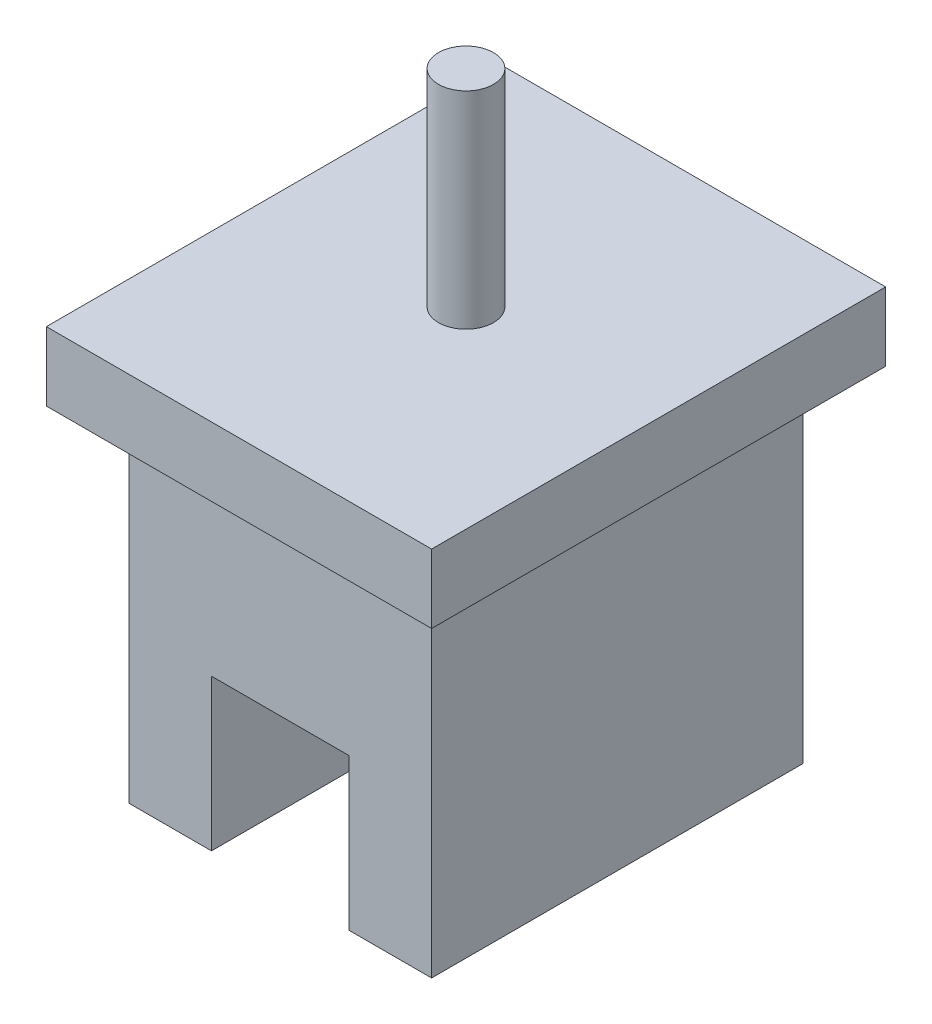
ISO-10303-21;
HEADER;
FILE_DESCRIPTION(('STEP AP214'),'2;1');
FILE_NAME('part.step','',(''),(''),'','','');
FILE_SCHEMA(('AUTOMOTIVE_DESIGN { 1 0 10303 214 1 1 1 1 }'));
ENDSEC;
DATA;
#1=APPLICATION_CONTEXT('core data for automotive mechanical design processes');
#2=APPLICATION_PROTOCOL_DEFINITION('international standard','automotive_design',2000,#1);
#3=PRODUCT_CONTEXT('',#1,'mechanical');
#4=PRODUCT('Part','Part','',(#3));
#5=PRODUCT_RELATED_PRODUCT_CATEGORY('part','',(#4));
#6=PRODUCT_DEFINITION_FORMATION('','',#4);
#7=PRODUCT_DEFINITION_CONTEXT('part definition',#1,'design');
#8=PRODUCT_DEFINITION('design','',#6,#7);
#9=PRODUCT_DEFINITION_SHAPE('','',#8);
#10=(LENGTH_UNIT() NAMED_UNIT(*) SI_UNIT(.MILLI.,.METRE.));
#11=(NAMED_UNIT(*) PLANE_ANGLE_UNIT() SI_UNIT($,.RADIAN.));
#12=(NAMED_UNIT(*) SI_UNIT($,.STERADIAN.) SOLID_ANGLE_UNIT());
#13=UNCERTAINTY_MEASURE_WITH_UNIT(LENGTH_MEASURE(1.E-05),#10,'distance_accuracy_value','');
#14=(GEOMETRIC_REPRESENTATION_CONTEXT(3) GLOBAL_UNCERTAINTY_ASSIGNED_CONTEXT((#13)) GLOBAL_UNIT_ASSIGNED_CONTEXT((#10,
#11,#12)) REPRESENTATION_CONTEXT('',''));
#15=CARTESIAN_POINT('',(0.,0.,0.));
#16=DIRECTION('',(0.,0.,1.));
#17=DIRECTION('',(1.,0.,0.));
#18=AXIS2_PLACEMENT_3D('',#15,#16,#17);
#19=CARTESIAN_POINT('',(-11.,0.,13.5));
#20=DIRECTION('',(0.,0.,-1.));
#21=DIRECTION('',(-1.,0.,0.));
#22=AXIS2_PLACEMENT_3D('',#19,#20,#21);
#23=PLANE('',#22);
#24=DIRECTION('',(0.,1.,0.));
#25=VECTOR('',#24,1.);
#26=CARTESIAN_POINT('',(5.,0.,13.5));
#27=LINE('',#26,#25);
#28=CARTESIAN_POINT('',(5.,-25.,13.5));
#29=VERTEX_POINT('',#28);
#30=CARTESIAN_POINT('',(5.,-14.,13.5));
#31=VERTEX_POINT('',#30);
#32=EDGE_CURVE('E148',#29,#31,#27,.T.);
#33=ORIENTED_EDGE('',*,*,#32,.F.);
#34=DIRECTION('',(1.,0.,0.));
#35=VECTOR('',#34,1.);
#36=CARTESIAN_POINT('',(-11.,-25.,13.5));
#37=LINE('',#36,#35);
#38=CARTESIAN_POINT('',(11.,-25.,13.5));
#39=VERTEX_POINT('',#38);
#40=EDGE_CURVE('E169',#29,#39,#37,.T.);
#41=ORIENTED_EDGE('',*,*,#40,.T.);
#42=DIRECTION('',(0.,-1.,0.));
#43=VECTOR('',#42,1.);
#44=CARTESIAN_POINT('',(11.,0.,13.5));
#45=LINE('',#44,#43);
#46=CARTESIAN_POINT('',(11.,0.,13.5));
#47=VERTEX_POINT('',#46);
#48=EDGE_CURVE('E195',#47,#39,#45,.T.);
#49=ORIENTED_EDGE('',*,*,#48,.F.);
#50=DIRECTION('',(1.,0.,0.));
#51=VECTOR('',#50,1.);
#52=CARTESIAN_POINT('',(-11.,0.,13.5));
#53=LINE('',#52,#51);
#54=CARTESIAN_POINT('',(-11.,0.,13.5));
#55=VERTEX_POINT('',#54);
#56=EDGE_CURVE('E177',#55,#47,#53,.T.);
#57=ORIENTED_EDGE('',*,*,#56,.F.);
#58=DIRECTION('',(0.,-1.,0.));
#59=VECTOR('',#58,1.);
#60=CARTESIAN_POINT('',(-11.,0.,13.5));
#61=LINE('',#60,#59);
#62=CARTESIAN_POINT('',(-11.,-25.,13.5));
#63=VERTEX_POINT('',#62);
#64=EDGE_CURVE('E193',#55,#63,#61,.T.);
#65=ORIENTED_EDGE('',*,*,#64,.T.);
#66=CARTESIAN_POINT('',(-5.,-25.,13.5));
#67=VERTEX_POINT('',#66);
#68=EDGE_CURVE('E158',#63,#67,#37,.T.);
#69=ORIENTED_EDGE('',*,*,#68,.T.);
#70=DIRECTION('',(0.,-1.,0.));
#71=VECTOR('',#70,1.);
#72=CARTESIAN_POINT('',(-5.,0.,13.5));
#73=LINE('',#72,#71);
#74=CARTESIAN_POINT('',(-5.,-14.,13.5));
#75=VERTEX_POINT('',#74);
#76=EDGE_CURVE('E64',#75,#67,#73,.T.);
#77=ORIENTED_EDGE('',*,*,#76,.F.);
#78=DIRECTION('',(-1.,0.,0.));
#79=VECTOR('',#78,1.);
#80=CARTESIAN_POINT('',(-11.,-14.,13.5));
#81=LINE('',#80,#79);
#82=EDGE_CURVE('E142',#31,#75,#81,.T.);
#83=ORIENTED_EDGE('',*,*,#82,.F.);
#84=EDGE_LOOP('',(#33,#41,#49,#57,#65,#69,#77,#83));
#85=FACE_BOUND('',#84,.T.);
#86=ADVANCED_FACE('F50',(#85),#23,.F.);
#87=CARTESIAN_POINT('',(11.,0.,-13.5));
#88=DIRECTION('',(0.,0.,1.));
#89=DIRECTION('',(1.,0.,0.));
#90=AXIS2_PLACEMENT_3D('',#87,#88,#89);
#91=PLANE('',#90);
#92=DIRECTION('',(0.,-1.,0.));
#93=VECTOR('',#92,1.);
#94=CARTESIAN_POINT('',(5.,0.,-13.5));
#95=LINE('',#94,#93);
#96=CARTESIAN_POINT('',(5.,-14.,-13.5));
#97=VERTEX_POINT('',#96);
#98=CARTESIAN_POINT('',(5.,-25.,-13.5));
#99=VERTEX_POINT('',#98);
#100=EDGE_CURVE('E160',#97,#99,#95,.T.);
#101=ORIENTED_EDGE('',*,*,#100,.F.);
#102=DIRECTION('',(1.,0.,0.));
#103=VECTOR('',#102,1.);
#104=CARTESIAN_POINT('',(11.,-14.,-13.5));
#105=LINE('',#104,#103);
#106=CARTESIAN_POINT('',(-5.,-14.,-13.5));
#107=VERTEX_POINT('',#106);
#108=EDGE_CURVE('E51',#107,#97,#105,.T.);
#109=ORIENTED_EDGE('',*,*,#108,.F.);
#110=DIRECTION('',(0.,1.,0.));
#111=VECTOR('',#110,1.);
#112=CARTESIAN_POINT('',(-5.,0.,-13.5));
#113=LINE('',#112,#111);
#114=CARTESIAN_POINT('',(-5.,-25.,-13.5));
#115=VERTEX_POINT('',#114);
#116=EDGE_CURVE('E152',#115,#107,#113,.T.);
#117=ORIENTED_EDGE('',*,*,#116,.F.);
#118=DIRECTION('',(-1.,0.,0.));
#119=VECTOR('',#118,1.);
#120=CARTESIAN_POINT('',(11.,-25.,-13.5));
#121=LINE('',#120,#119);
#122=CARTESIAN_POINT('',(-11.,-25.,-13.5));
#123=VERTEX_POINT('',#122);
#124=EDGE_CURVE('E172',#115,#123,#121,.T.);
#125=ORIENTED_EDGE('',*,*,#124,.T.);
#126=DIRECTION('',(0.,-1.,0.));
#127=VECTOR('',#126,1.);
#128=CARTESIAN_POINT('',(-11.,0.,-13.5));
#129=LINE('',#128,#127);
#130=CARTESIAN_POINT('',(-11.,0.,-13.5));
#131=VERTEX_POINT('',#130);
#132=EDGE_CURVE('E189',#131,#123,#129,.T.);
#133=ORIENTED_EDGE('',*,*,#132,.F.);
#134=DIRECTION('',(-1.,0.,0.));
#135=VECTOR('',#134,1.);
#136=CARTESIAN_POINT('',(11.,0.,-13.5));
#137=LINE('',#136,#135);
#138=CARTESIAN_POINT('',(11.,0.,-13.5));
#139=VERTEX_POINT('',#138);
#140=EDGE_CURVE('E184',#139,#131,#137,.T.);
#141=ORIENTED_EDGE('',*,*,#140,.F.);
#142=DIRECTION('',(0.,-1.,0.));
#143=VECTOR('',#142,1.);
#144=CARTESIAN_POINT('',(11.,0.,-13.5));
#145=LINE('',#144,#143);
#146=CARTESIAN_POINT('',(11.,-25.,-13.5));
#147=VERTEX_POINT('',#146);
#148=EDGE_CURVE('E188',#139,#147,#145,.T.);
#149=ORIENTED_EDGE('',*,*,#148,.T.);
#150=EDGE_CURVE('E174',#147,#99,#121,.T.);
#151=ORIENTED_EDGE('',*,*,#150,.T.);
#152=EDGE_LOOP('',(#101,#109,#117,#125,#133,#141,#149,#151));
#153=FACE_BOUND('',#152,.T.);
#154=ADVANCED_FACE('F234',(#153),#91,.F.);
#155=CARTESIAN_POINT('',(0.,-25.,0.));
#156=DIRECTION('',(0.,1.,0.));
#157=DIRECTION('',(0.,0.,1.));
#158=AXIS2_PLACEMENT_3D('',#155,#156,#157);
#159=PLANE('',#158);
#160=DIRECTION('',(0.,0.,1.));
#161=VECTOR('',#160,1.);
#162=CARTESIAN_POINT('',(5.,-25.,0.));
#163=LINE('',#162,#161);
#164=EDGE_CURVE('E226',#99,#29,#163,.T.);
#165=ORIENTED_EDGE('',*,*,#164,.F.);
#166=ORIENTED_EDGE('',*,*,#150,.F.);
#167=DIRECTION('',(0.,0.,-1.));
#168=VECTOR('',#167,1.);
#169=CARTESIAN_POINT('',(11.,-25.,13.5));
#170=LINE('',#169,#168);
#171=EDGE_CURVE('E171',#39,#147,#170,.T.);
#172=ORIENTED_EDGE('',*,*,#171,.F.);
#173=ORIENTED_EDGE('',*,*,#40,.F.);
#174=EDGE_LOOP('',(#165,#166,#172,#173));
#175=FACE_BOUND('',#174,.T.);
#176=ADVANCED_FACE('F237',(#175),#159,.F.);
#177=DIRECTION('',(0.,0.,-1.));
#178=VECTOR('',#177,1.);
#179=CARTESIAN_POINT('',(-5.,-25.,0.));
#180=LINE('',#179,#178);
#181=EDGE_CURVE('E227',#67,#115,#180,.T.);
#182=ORIENTED_EDGE('',*,*,#181,.F.);
#183=ORIENTED_EDGE('',*,*,#68,.F.);
#184=DIRECTION('',(0.,0.,1.));
#185=VECTOR('',#184,1.);
#186=CARTESIAN_POINT('',(-11.,-25.,-13.5));
#187=LINE('',#186,#185);
#188=EDGE_CURVE('E146',#123,#63,#187,.T.);
#189=ORIENTED_EDGE('',*,*,#188,.F.);
#190=ORIENTED_EDGE('',*,*,#124,.F.);
#191=EDGE_LOOP('',(#182,#183,#189,#190));
#192=FACE_BOUND('',#191,.T.);
#193=ADVANCED_FACE('F249',(#192),#159,.F.);
#194=CARTESIAN_POINT('',(0.,0.,0.));
#195=DIRECTION('',(0.,-1.,0.));
#196=DIRECTION('',(0.,0.,-1.));
#197=AXIS2_PLACEMENT_3D('',#194,#195,#196);
#198=PLANE('',#197);
#199=DIRECTION('',(0.,0.,-1.));
#200=VECTOR('',#199,1.);
#201=CARTESIAN_POINT('',(14.,0.,16.5));
#202=LINE('',#201,#200);
#203=CARTESIAN_POINT('',(14.,0.,16.5));
#204=VERTEX_POINT('',#203);
#205=CARTESIAN_POINT('',(14.,0.,-16.5));
#206=VERTEX_POINT('',#205);
#207=EDGE_CURVE('E200',#204,#206,#202,.T.);
#208=ORIENTED_EDGE('',*,*,#207,.F.);
#209=DIRECTION('',(1.,0.,0.));
#210=VECTOR('',#209,1.);
#211=CARTESIAN_POINT('',(-14.,0.,16.5));
#212=LINE('',#211,#210);
#213=CARTESIAN_POINT('',(-14.,0.,16.5));
#214=VERTEX_POINT('',#213);
#215=EDGE_CURVE('E202',#214,#204,#212,.T.);
#216=ORIENTED_EDGE('',*,*,#215,.F.);
#217=DIRECTION('',(0.,0.,1.));
#218=VECTOR('',#217,1.);
#219=CARTESIAN_POINT('',(-14.,0.,16.5));
#220=LINE('',#219,#218);
#221=CARTESIAN_POINT('',(-14.,0.,-16.5));
#222=VERTEX_POINT('',#221);
#223=EDGE_CURVE('E214',#222,#214,#220,.T.);
#224=ORIENTED_EDGE('',*,*,#223,.F.);
#225=DIRECTION('',(-1.,0.,0.));
#226=VECTOR('',#225,1.);
#227=CARTESIAN_POINT('',(-14.,0.,-16.5));
#228=LINE('',#227,#226);
#229=EDGE_CURVE('E212',#206,#222,#228,.T.);
#230=ORIENTED_EDGE('',*,*,#229,.F.);
#231=EDGE_LOOP('',(#208,#216,#224,#230));
#232=FACE_BOUND('',#231,.T.);
#233=ORIENTED_EDGE('',*,*,#140,.T.);
#234=DIRECTION('',(0.,0.,1.));
#235=VECTOR('',#234,1.);
#236=CARTESIAN_POINT('',(-11.,0.,-13.5));
#237=LINE('',#236,#235);
#238=EDGE_CURVE('E71',#131,#55,#237,.T.);
#239=ORIENTED_EDGE('',*,*,#238,.T.);
#240=ORIENTED_EDGE('',*,*,#56,.T.);
#241=DIRECTION('',(0.,0.,-1.));
#242=VECTOR('',#241,1.);
#243=CARTESIAN_POINT('',(11.,0.,13.5));
#244=LINE('',#243,#242);
#245=EDGE_CURVE('E185',#47,#139,#244,.T.);
#246=ORIENTED_EDGE('',*,*,#245,.T.);
#247=EDGE_LOOP('',(#233,#239,#240,#246));
#248=FACE_BOUND('',#247,.T.);
#249=ADVANCED_FACE('F244',(#232,#248),#198,.T.);
#250=CARTESIAN_POINT('',(14.,5.,16.5));
#251=DIRECTION('',(-1.,0.,0.));
#252=DIRECTION('',(0.,0.,1.));
#253=AXIS2_PLACEMENT_3D('',#250,#251,#252);
#254=PLANE('',#253);
#255=ORIENTED_EDGE('',*,*,#207,.T.);
#256=DIRECTION('',(0.,-1.,0.));
#257=VECTOR('',#256,1.);
#258=CARTESIAN_POINT('',(14.,5.,-16.5));
#259=LINE('',#258,#257);
#260=CARTESIAN_POINT('',(14.,5.,-16.5));
#261=VERTEX_POINT('',#260);
#262=EDGE_CURVE('E223',#261,#206,#259,.T.);
#263=ORIENTED_EDGE('',*,*,#262,.F.);
#264=DIRECTION('',(0.,0.,-1.));
#265=VECTOR('',#264,1.);
#266=CARTESIAN_POINT('',(14.,5.,16.5));
#267=LINE('',#266,#265);
#268=CARTESIAN_POINT('',(14.,5.,16.5));
#269=VERTEX_POINT('',#268);
#270=EDGE_CURVE('E198',#269,#261,#267,.T.);
#271=ORIENTED_EDGE('',*,*,#270,.F.);
#272=DIRECTION('',(0.,-1.,0.));
#273=VECTOR('',#272,1.);
#274=CARTESIAN_POINT('',(14.,5.,16.5));
#275=LINE('',#274,#273);
#276=EDGE_CURVE('E206',#269,#204,#275,.T.);
#277=ORIENTED_EDGE('',*,*,#276,.T.);
#278=EDGE_LOOP('',(#255,#263,#271,#277));
#279=FACE_BOUND('',#278,.T.);
#280=ADVANCED_FACE('F47',(#279),#254,.F.);
#281=CARTESIAN_POINT('',(-14.,5.,-16.5));
#282=DIRECTION('',(0.,0.,1.));
#283=DIRECTION('',(1.,0.,0.));
#284=AXIS2_PLACEMENT_3D('',#281,#282,#283);
#285=PLANE('',#284);
#286=ORIENTED_EDGE('',*,*,#229,.T.);
#287=DIRECTION('',(0.,-1.,0.));
#288=VECTOR('',#287,1.);
#289=CARTESIAN_POINT('',(-14.,5.,-16.5));
#290=LINE('',#289,#288);
#291=CARTESIAN_POINT('',(-14.,5.,-16.5));
#292=VERTEX_POINT('',#291);
#293=EDGE_CURVE('E221',#292,#222,#290,.T.);
#294=ORIENTED_EDGE('',*,*,#293,.F.);
#295=DIRECTION('',(-1.,0.,0.));
#296=VECTOR('',#295,1.);
#297=CARTESIAN_POINT('',(-14.,5.,-16.5));
#298=LINE('',#297,#296);
#299=EDGE_CURVE('E201',#261,#292,#298,.T.);
#300=ORIENTED_EDGE('',*,*,#299,.F.);
#301=ORIENTED_EDGE('',*,*,#262,.T.);
#302=EDGE_LOOP('',(#286,#294,#300,#301));
#303=FACE_BOUND('',#302,.T.);
#304=ADVANCED_FACE('F285',(#303),#285,.F.);
#305=CARTESIAN_POINT('',(-14.,5.,16.5));
#306=DIRECTION('',(1.,0.,0.));
#307=DIRECTION('',(0.,0.,-1.));
#308=AXIS2_PLACEMENT_3D('',#305,#306,#307);
#309=PLANE('',#308);
#310=ORIENTED_EDGE('',*,*,#223,.T.);
#311=DIRECTION('',(0.,-1.,0.));
#312=VECTOR('',#311,1.);
#313=CARTESIAN_POINT('',(-14.,5.,16.5));
#314=LINE('',#313,#312);
#315=CARTESIAN_POINT('',(-14.,5.,16.5));
#316=VERTEX_POINT('',#315);
#317=EDGE_CURVE('E218',#316,#214,#314,.T.);
#318=ORIENTED_EDGE('',*,*,#317,.F.);
#319=DIRECTION('',(0.,0.,1.));
#320=VECTOR('',#319,1.);
#321=CARTESIAN_POINT('',(-14.,5.,16.5));
#322=LINE('',#321,#320);
#323=EDGE_CURVE('E203',#292,#316,#322,.T.);
#324=ORIENTED_EDGE('',*,*,#323,.F.);
#325=ORIENTED_EDGE('',*,*,#293,.T.);
#326=EDGE_LOOP('',(#310,#318,#324,#325));
#327=FACE_BOUND('',#326,.T.);
#328=ADVANCED_FACE('F276',(#327),#309,.F.);
#329=CARTESIAN_POINT('',(-14.,5.,16.5));
#330=DIRECTION('',(0.,0.,-1.));
#331=DIRECTION('',(-1.,0.,0.));
#332=AXIS2_PLACEMENT_3D('',#329,#330,#331);
#333=PLANE('',#332);
#334=ORIENTED_EDGE('',*,*,#215,.T.);
#335=ORIENTED_EDGE('',*,*,#276,.F.);
#336=DIRECTION('',(1.,0.,0.));
#337=VECTOR('',#336,1.);
#338=CARTESIAN_POINT('',(-14.,5.,16.5));
#339=LINE('',#338,#337);
#340=EDGE_CURVE('E207',#316,#269,#339,.T.);
#341=ORIENTED_EDGE('',*,*,#340,.F.);
#342=ORIENTED_EDGE('',*,*,#317,.T.);
#343=EDGE_LOOP('',(#334,#335,#341,#342));
#344=FACE_BOUND('',#343,.T.);
#345=ADVANCED_FACE('F274',(#344),#333,.F.);
#346=CARTESIAN_POINT('',(0.,5.,0.));
#347=DIRECTION('',(0.,-1.,0.));
#348=DIRECTION('',(0.,0.,-1.));
#349=AXIS2_PLACEMENT_3D('',#346,#347,#348);
#350=PLANE('',#349);
#351=CARTESIAN_POINT('',(0.,5.,0.));
#352=DIRECTION('',(0.,1.,0.));
#353=DIRECTION('',(0.,0.,1.));
#354=AXIS2_PLACEMENT_3D('',#351,#352,#353);
#355=CIRCLE('',#354,2.);
#356=CARTESIAN_POINT('',(0.,5.,2.));
#357=VERTEX_POINT('',#356);
#358=EDGE_CURVE('E11',#357,#357,#355,.T.);
#359=ORIENTED_EDGE('',*,*,#358,.F.);
#360=EDGE_LOOP('',(#359));
#361=FACE_BOUND('',#360,.T.);
#362=ORIENTED_EDGE('',*,*,#270,.T.);
#363=ORIENTED_EDGE('',*,*,#299,.T.);
#364=ORIENTED_EDGE('',*,*,#323,.T.);
#365=ORIENTED_EDGE('',*,*,#340,.T.);
#366=EDGE_LOOP('',(#362,#363,#364,#365));
#367=FACE_BOUND('',#366,.T.);
#368=ADVANCED_FACE('F275',(#361,#367),#350,.F.);
#369=CARTESIAN_POINT('',(-11.,0.,-13.5));
#370=DIRECTION('',(1.,0.,0.));
#371=DIRECTION('',(0.,0.,-1.));
#372=AXIS2_PLACEMENT_3D('',#369,#370,#371);
#373=PLANE('',#372);
#374=ORIENTED_EDGE('',*,*,#132,.T.);
#375=ORIENTED_EDGE('',*,*,#188,.T.);
#376=ORIENTED_EDGE('',*,*,#64,.F.);
#377=ORIENTED_EDGE('',*,*,#238,.F.);
#378=EDGE_LOOP('',(#374,#375,#376,#377));
#379=FACE_BOUND('',#378,.T.);
#380=ADVANCED_FACE('F246',(#379),#373,.F.);
#381=CARTESIAN_POINT('',(11.,0.,13.5));
#382=DIRECTION('',(-1.,0.,0.));
#383=DIRECTION('',(0.,0.,1.));
#384=AXIS2_PLACEMENT_3D('',#381,#382,#383);
#385=PLANE('',#384);
#386=ORIENTED_EDGE('',*,*,#48,.T.);
#387=ORIENTED_EDGE('',*,*,#171,.T.);
#388=ORIENTED_EDGE('',*,*,#148,.F.);
#389=ORIENTED_EDGE('',*,*,#245,.F.);
#390=EDGE_LOOP('',(#386,#387,#388,#389));
#391=FACE_BOUND('',#390,.T.);
#392=ADVANCED_FACE('F243',(#391),#385,.F.);
#393=CARTESIAN_POINT('',(-5.,-14.,16.5));
#394=DIRECTION('',(0.,-1.,0.));
#395=DIRECTION('',(0.,0.,-1.));
#396=AXIS2_PLACEMENT_3D('',#393,#394,#395);
#397=PLANE('',#396);
#398=ORIENTED_EDGE('',*,*,#82,.T.);
#399=DIRECTION('',(0.,0.,-1.));
#400=VECTOR('',#399,1.);
#401=CARTESIAN_POINT('',(-5.,-14.,16.5));
#402=LINE('',#401,#400);
#403=EDGE_CURVE('E141',#75,#107,#402,.T.);
#404=ORIENTED_EDGE('',*,*,#403,.T.);
#405=ORIENTED_EDGE('',*,*,#108,.T.);
#406=DIRECTION('',(0.,0.,-1.));
#407=VECTOR('',#406,1.);
#408=CARTESIAN_POINT('',(5.,-14.,16.5));
#409=LINE('',#408,#407);
#410=EDGE_CURVE('E147',#31,#97,#409,.T.);
#411=ORIENTED_EDGE('',*,*,#410,.F.);
#412=EDGE_LOOP('',(#398,#404,#405,#411));
#413=FACE_BOUND('',#412,.T.);
#414=ADVANCED_FACE('F145',(#413),#397,.T.);
#415=CARTESIAN_POINT('',(5.,-26.,16.5));
#416=DIRECTION('',(-1.,0.,0.));
#417=DIRECTION('',(0.,0.,1.));
#418=AXIS2_PLACEMENT_3D('',#415,#416,#417);
#419=PLANE('',#418);
#420=ORIENTED_EDGE('',*,*,#32,.T.);
#421=ORIENTED_EDGE('',*,*,#410,.T.);
#422=ORIENTED_EDGE('',*,*,#100,.T.);
#423=ORIENTED_EDGE('',*,*,#164,.T.);
#424=EDGE_LOOP('',(#420,#421,#422,#423));
#425=FACE_BOUND('',#424,.T.);
#426=ADVANCED_FACE('F231',(#425),#419,.T.);
#427=CARTESIAN_POINT('',(-5.,-26.,16.5));
#428=DIRECTION('',(1.,0.,0.));
#429=DIRECTION('',(0.,0.,-1.));
#430=AXIS2_PLACEMENT_3D('',#427,#428,#429);
#431=PLANE('',#430);
#432=ORIENTED_EDGE('',*,*,#76,.T.);
#433=ORIENTED_EDGE('',*,*,#181,.T.);
#434=ORIENTED_EDGE('',*,*,#116,.T.);
#435=ORIENTED_EDGE('',*,*,#403,.F.);
#436=EDGE_LOOP('',(#432,#433,#434,#435));
#437=FACE_BOUND('',#436,.T.);
#438=ADVANCED_FACE('F155',(#437),#431,.T.);
#439=CARTESIAN_POINT('',(0.,20.,0.));
#440=DIRECTION('',(0.,-1.,0.));
#441=DIRECTION('',(0.,0.,-1.));
#442=AXIS2_PLACEMENT_3D('',#439,#440,#441);
#443=CYLINDRICAL_SURFACE('',#442,2.);
#444=CARTESIAN_POINT('',(0.,20.,0.));
#445=DIRECTION('',(0.,1.,0.));
#446=DIRECTION('',(0.,0.,1.));
#447=AXIS2_PLACEMENT_3D('',#444,#445,#446);
#448=CIRCLE('',#447,2.);
#449=CARTESIAN_POINT('',(0.,20.,2.));
#450=VERTEX_POINT('',#449);
#451=EDGE_CURVE('E154',#450,#450,#448,.T.);
#452=ORIENTED_EDGE('',*,*,#451,.F.);
#453=EDGE_LOOP('',(#452));
#454=FACE_BOUND('',#453,.T.);
#455=ORIENTED_EDGE('',*,*,#358,.T.);
#456=EDGE_LOOP('',(#455));
#457=FACE_BOUND('',#456,.T.);
#458=ADVANCED_FACE('F396',(#454,#457),#443,.T.);
#459=CARTESIAN_POINT('',(0.,20.,0.));
#460=DIRECTION('',(0.,1.,0.));
#461=DIRECTION('',(0.,0.,1.));
#462=AXIS2_PLACEMENT_3D('',#459,#460,#461);
#463=PLANE('',#462);
#464=ORIENTED_EDGE('',*,*,#451,.T.);
#465=EDGE_LOOP('',(#464));
#466=FACE_BOUND('',#465,.T.);
#467=ADVANCED_FACE('F403',(#466),#463,.T.);
#468=CLOSED_SHELL('',(#86,#154,#176,#193,#249,#280,#304,#328,#345,#368,#380,#392,#414,#426,#438,
#458,#467));
#469=MANIFOLD_SOLID_BREP('B2',#468);
#470=ADVANCED_BREP_SHAPE_REPRESENTATION('',(#18,#469),#14);
#471=SHAPE_DEFINITION_REPRESENTATION(#9,#470);
ENDSEC;
END-ISO-10303-21;
